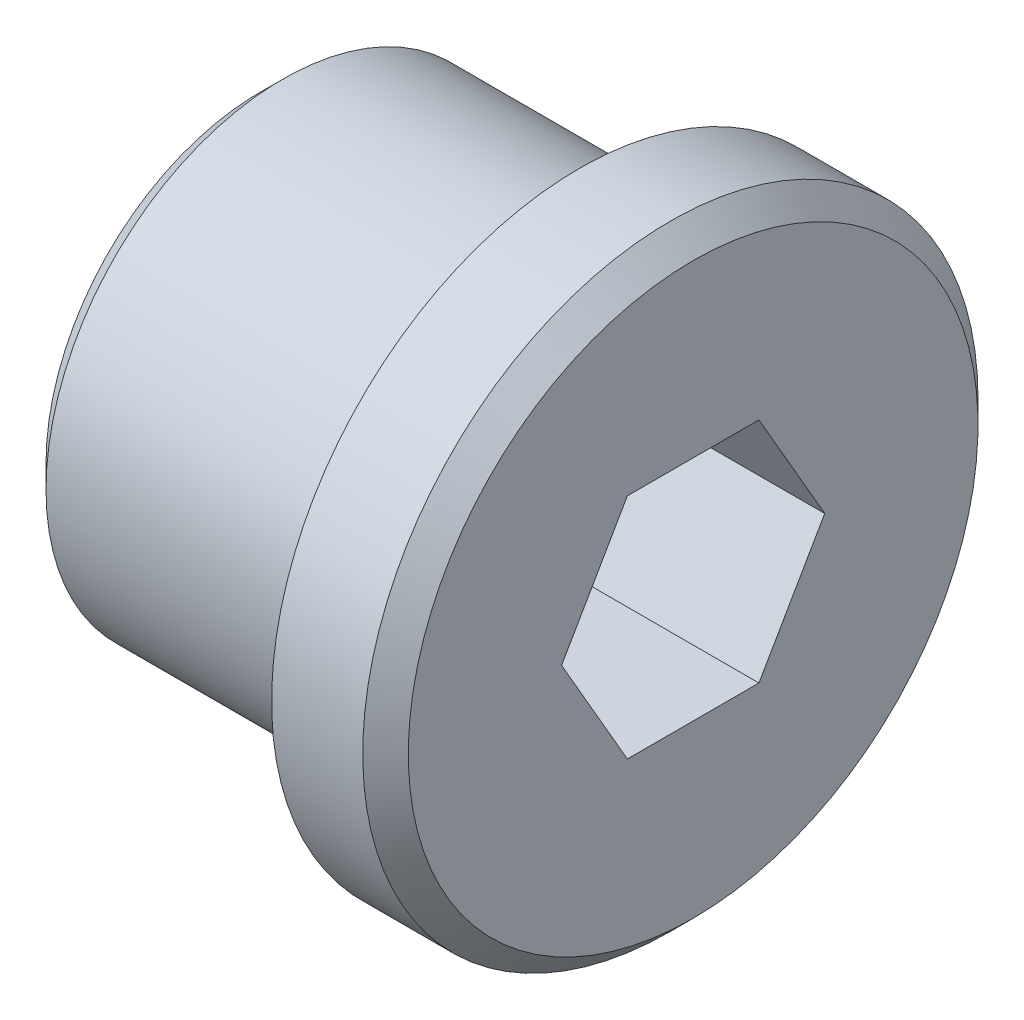
ISO-10303-21;
HEADER;
FILE_DESCRIPTION(('STEP AP214'),'2;1');
FILE_NAME('part.step','',(''),(''),'','','');
FILE_SCHEMA(('AUTOMOTIVE_DESIGN { 1 0 10303 214 1 1 1 1 }'));
ENDSEC;
DATA;
#1=APPLICATION_CONTEXT('core data for automotive mechanical design processes');
#2=APPLICATION_PROTOCOL_DEFINITION('international standard','automotive_design',2000,#1);
#3=PRODUCT_CONTEXT('',#1,'mechanical');
#4=PRODUCT('Part','Part','',(#3));
#5=PRODUCT_RELATED_PRODUCT_CATEGORY('part','',(#4));
#6=PRODUCT_DEFINITION_FORMATION('','',#4);
#7=PRODUCT_DEFINITION_CONTEXT('part definition',#1,'design');
#8=PRODUCT_DEFINITION('design','',#6,#7);
#9=PRODUCT_DEFINITION_SHAPE('','',#8);
#10=(LENGTH_UNIT() NAMED_UNIT(*) SI_UNIT(.MILLI.,.METRE.));
#11=(NAMED_UNIT(*) PLANE_ANGLE_UNIT() SI_UNIT($,.RADIAN.));
#12=(NAMED_UNIT(*) SI_UNIT($,.STERADIAN.) SOLID_ANGLE_UNIT());
#13=UNCERTAINTY_MEASURE_WITH_UNIT(LENGTH_MEASURE(1.E-05),#10,'distance_accuracy_value','');
#14=(GEOMETRIC_REPRESENTATION_CONTEXT(3) GLOBAL_UNCERTAINTY_ASSIGNED_CONTEXT((#13)) GLOBAL_UNIT_ASSIGNED_CONTEXT((#10,
#11,#12)) REPRESENTATION_CONTEXT('',''));
#15=CARTESIAN_POINT('',(0.,0.,0.));
#16=DIRECTION('',(0.,0.,1.));
#17=DIRECTION('',(1.,0.,0.));
#18=AXIS2_PLACEMENT_3D('',#15,#16,#17);
#19=CARTESIAN_POINT('',(186.5,-5.,222.660254037845));
#20=DIRECTION('',(1.,0.,0.));
#21=DIRECTION('',(0.,0.,-1.));
#22=AXIS2_PLACEMENT_3D('',#19,#20,#21);
#23=PLANE('',#22);
#24=DIRECTION('',(0.,0.,-1.));
#25=VECTOR('',#24,1.);
#26=CARTESIAN_POINT('',(186.5,-5.,216.886751345948));
#27=LINE('',#26,#25);
#28=CARTESIAN_POINT('',(186.5,-5.00000000000019,216.886751345948));
#29=VERTEX_POINT('',#28);
#30=CARTESIAN_POINT('',(186.5,-5.,211.113248654052));
#31=VERTEX_POINT('',#30);
#32=EDGE_CURVE('E68',#29,#31,#27,.T.);
#33=ORIENTED_EDGE('',*,*,#32,.T.);
#34=DIRECTION('',(0.,0.866025403784439,-0.5));
#35=VECTOR('',#34,1.);
#36=CARTESIAN_POINT('',(186.5,-5.,211.113248654052));
#37=LINE('',#36,#35);
#38=CARTESIAN_POINT('',(186.5,0.,208.226497308104));
#39=VERTEX_POINT('',#38);
#40=EDGE_CURVE('E91',#31,#39,#37,.T.);
#41=ORIENTED_EDGE('',*,*,#40,.T.);
#42=DIRECTION('',(0.,0.866025403784439,0.5));
#43=VECTOR('',#42,1.);
#44=CARTESIAN_POINT('',(186.5,0.,208.226497308104));
#45=LINE('',#44,#43);
#46=CARTESIAN_POINT('',(186.5,4.99999999999998,211.113248654052));
#47=VERTEX_POINT('',#46);
#48=EDGE_CURVE('E134',#39,#47,#45,.T.);
#49=ORIENTED_EDGE('',*,*,#48,.T.);
#50=DIRECTION('',(0.,0.,1.));
#51=VECTOR('',#50,1.);
#52=CARTESIAN_POINT('',(186.5,5.,211.113248654052));
#53=LINE('',#52,#51);
#54=CARTESIAN_POINT('',(186.5,5.,216.886751345948));
#55=VERTEX_POINT('',#54);
#56=EDGE_CURVE('E129',#47,#55,#53,.T.);
#57=ORIENTED_EDGE('',*,*,#56,.T.);
#58=DIRECTION('',(0.,-0.866025403784439,0.5));
#59=VECTOR('',#58,1.);
#60=CARTESIAN_POINT('',(186.5,5.,216.886751345948));
#61=LINE('',#60,#59);
#62=CARTESIAN_POINT('',(186.5,-1.69613679076899E-13,219.773502691897));
#63=VERTEX_POINT('',#62);
#64=EDGE_CURVE('E74',#55,#63,#61,.T.);
#65=ORIENTED_EDGE('',*,*,#64,.T.);
#66=DIRECTION('',(0.,-0.866025403784439,-0.5));
#67=VECTOR('',#66,1.);
#68=CARTESIAN_POINT('',(186.5,0.,219.773502691897));
#69=LINE('',#68,#67);
#70=EDGE_CURVE('E71',#63,#29,#69,.T.);
#71=ORIENTED_EDGE('',*,*,#70,.T.);
#72=EDGE_LOOP('',(#33,#41,#49,#57,#65,#71));
#73=FACE_BOUND('',#72,.T.);
#74=ADVANCED_FACE('F17',(#73),#23,.T.);
#75=CARTESIAN_POINT('',(186.5,0.,219.773502691897));
#76=DIRECTION('',(0.,-0.5,0.866025403784439));
#77=DIRECTION('',(0.,-0.866025403784439,-0.5));
#78=AXIS2_PLACEMENT_3D('',#75,#76,#77);
#79=PLANE('',#78);
#80=ORIENTED_EDGE('',*,*,#70,.F.);
#81=DIRECTION('',(1.,0.,0.));
#82=VECTOR('',#81,1.);
#83=CARTESIAN_POINT('',(186.5,-4.37150315946155E-13,219.773502691896));
#84=LINE('',#83,#82);
#85=CARTESIAN_POINT('',(194.,-1.621143570697E-13,219.773502691897));
#86=VERTEX_POINT('',#85);
#87=EDGE_CURVE('E124',#63,#86,#84,.T.);
#88=ORIENTED_EDGE('',*,*,#87,.T.);
#89=DIRECTION('',(0.,-0.866025403784371,-0.500000000000118));
#90=VECTOR('',#89,1.);
#91=CARTESIAN_POINT('',(194.,0.,219.773502691897));
#92=LINE('',#91,#90);
#93=CARTESIAN_POINT('',(194.,-5.00000000000019,216.886751345948));
#94=VERTEX_POINT('',#93);
#95=EDGE_CURVE('E82',#86,#94,#92,.T.);
#96=ORIENTED_EDGE('',*,*,#95,.T.);
#97=DIRECTION('',(1.,0.,0.));
#98=VECTOR('',#97,1.);
#99=CARTESIAN_POINT('',(186.5,-5.,216.886751345948));
#100=LINE('',#99,#98);
#101=EDGE_CURVE('E77',#94,#29,#100,.F.);
#102=ORIENTED_EDGE('',*,*,#101,.T.);
#103=EDGE_LOOP('',(#80,#88,#96,#102));
#104=FACE_BOUND('',#103,.T.);
#105=ADVANCED_FACE('F80',(#104),#79,.F.);
#106=CARTESIAN_POINT('',(186.5,-5.,216.886751345948));
#107=DIRECTION('',(0.,-1.,0.));
#108=DIRECTION('',(0.,0.,-1.));
#109=AXIS2_PLACEMENT_3D('',#106,#107,#108);
#110=PLANE('',#109);
#111=ORIENTED_EDGE('',*,*,#32,.F.);
#112=ORIENTED_EDGE('',*,*,#101,.F.);
#113=DIRECTION('',(0.,0.,1.));
#114=VECTOR('',#113,1.);
#115=CARTESIAN_POINT('',(194.,-5.,214.));
#116=LINE('',#115,#114);
#117=CARTESIAN_POINT('',(194.,-5.,211.113248654052));
#118=VERTEX_POINT('',#117);
#119=EDGE_CURVE('E121',#94,#118,#116,.F.);
#120=ORIENTED_EDGE('',*,*,#119,.T.);
#121=DIRECTION('',(1.,0.,0.));
#122=VECTOR('',#121,1.);
#123=CARTESIAN_POINT('',(186.5,-5.,211.113248654052));
#124=LINE('',#123,#122);
#125=EDGE_CURVE('E88',#118,#31,#124,.F.);
#126=ORIENTED_EDGE('',*,*,#125,.T.);
#127=EDGE_LOOP('',(#111,#112,#120,#126));
#128=FACE_BOUND('',#127,.T.);
#129=ADVANCED_FACE('F86',(#128),#110,.F.);
#130=CARTESIAN_POINT('',(186.5,-5.,211.113248654052));
#131=DIRECTION('',(0.,-0.5,-0.866025403784439));
#132=DIRECTION('',(0.,0.866025403784439,-0.5));
#133=AXIS2_PLACEMENT_3D('',#130,#131,#132);
#134=PLANE('',#133);
#135=ORIENTED_EDGE('',*,*,#40,.F.);
#136=ORIENTED_EDGE('',*,*,#125,.F.);
#137=DIRECTION('',(0.,0.866025403784446,-0.499999999999987));
#138=VECTOR('',#137,1.);
#139=CARTESIAN_POINT('',(194.,-5.,211.113248654052));
#140=LINE('',#139,#138);
#141=CARTESIAN_POINT('',(194.,0.,208.226497308104));
#142=VERTEX_POINT('',#141);
#143=EDGE_CURVE('E119',#118,#142,#140,.T.);
#144=ORIENTED_EDGE('',*,*,#143,.T.);
#145=DIRECTION('',(1.,0.,0.));
#146=VECTOR('',#145,1.);
#147=CARTESIAN_POINT('',(186.5,0.,208.226497308104));
#148=LINE('',#147,#146);
#149=EDGE_CURVE('E136',#142,#39,#148,.F.);
#150=ORIENTED_EDGE('',*,*,#149,.T.);
#151=EDGE_LOOP('',(#135,#136,#144,#150));
#152=FACE_BOUND('',#151,.T.);
#153=ADVANCED_FACE('F141',(#152),#134,.F.);
#154=CARTESIAN_POINT('',(186.5,0.,208.226497308104));
#155=DIRECTION('',(0.,0.5,-0.866025403784439));
#156=DIRECTION('',(0.,0.866025403784439,0.5));
#157=AXIS2_PLACEMENT_3D('',#154,#155,#156);
#158=PLANE('',#157);
#159=ORIENTED_EDGE('',*,*,#48,.F.);
#160=ORIENTED_EDGE('',*,*,#149,.F.);
#161=DIRECTION('',(0.,0.866025403784448,0.499999999999983));
#162=VECTOR('',#161,1.);
#163=CARTESIAN_POINT('',(194.,0.,208.226497308104));
#164=LINE('',#163,#162);
#165=CARTESIAN_POINT('',(194.,4.99999999999998,211.113248654052));
#166=VERTEX_POINT('',#165);
#167=EDGE_CURVE('E117',#142,#166,#164,.T.);
#168=ORIENTED_EDGE('',*,*,#167,.T.);
#169=DIRECTION('',(1.,0.,0.));
#170=VECTOR('',#169,1.);
#171=CARTESIAN_POINT('',(186.5,5.,211.113248654052));
#172=LINE('',#171,#170);
#173=EDGE_CURVE('E131',#166,#47,#172,.F.);
#174=ORIENTED_EDGE('',*,*,#173,.T.);
#175=EDGE_LOOP('',(#159,#160,#168,#174));
#176=FACE_BOUND('',#175,.T.);
#177=ADVANCED_FACE('F145',(#176),#158,.F.);
#178=CARTESIAN_POINT('',(186.5,5.,211.113248654052));
#179=DIRECTION('',(0.,1.,0.));
#180=DIRECTION('',(0.,0.,1.));
#181=AXIS2_PLACEMENT_3D('',#178,#179,#180);
#182=PLANE('',#181);
#183=ORIENTED_EDGE('',*,*,#56,.F.);
#184=ORIENTED_EDGE('',*,*,#173,.F.);
#185=DIRECTION('',(0.,0.,1.));
#186=VECTOR('',#185,1.);
#187=CARTESIAN_POINT('',(194.,5.,214.));
#188=LINE('',#187,#186);
#189=CARTESIAN_POINT('',(194.,5.,216.886751345948));
#190=VERTEX_POINT('',#189);
#191=EDGE_CURVE('E35',#166,#190,#188,.T.);
#192=ORIENTED_EDGE('',*,*,#191,.T.);
#193=DIRECTION('',(1.,0.,0.));
#194=VECTOR('',#193,1.);
#195=CARTESIAN_POINT('',(186.5,5.,216.886751345948));
#196=LINE('',#195,#194);
#197=EDGE_CURVE('E127',#190,#55,#196,.F.);
#198=ORIENTED_EDGE('',*,*,#197,.T.);
#199=EDGE_LOOP('',(#183,#184,#192,#198));
#200=FACE_BOUND('',#199,.T.);
#201=ADVANCED_FACE('F147',(#200),#182,.F.);
#202=CARTESIAN_POINT('',(186.5,5.,216.886751345948));
#203=DIRECTION('',(0.,0.5,0.866025403784439));
#204=DIRECTION('',(0.,-0.866025403784439,0.5));
#205=AXIS2_PLACEMENT_3D('',#202,#203,#204);
#206=PLANE('',#205);
#207=ORIENTED_EDGE('',*,*,#64,.F.);
#208=ORIENTED_EDGE('',*,*,#197,.F.);
#209=DIRECTION('',(0.,-0.866025403784378,0.500000000000104));
#210=VECTOR('',#209,1.);
#211=CARTESIAN_POINT('',(194.,5.,216.886751345948));
#212=LINE('',#211,#210);
#213=EDGE_CURVE('E107',#190,#86,#212,.T.);
#214=ORIENTED_EDGE('',*,*,#213,.T.);
#215=ORIENTED_EDGE('',*,*,#87,.F.);
#216=EDGE_LOOP('',(#207,#208,#214,#215));
#217=FACE_BOUND('',#216,.T.);
#218=ADVANCED_FACE('F150',(#217),#206,.F.);
#219=CARTESIAN_POINT('',(194.,0.,214.));
#220=DIRECTION('',(-1.,0.,0.));
#221=DIRECTION('',(0.,0.,1.));
#222=AXIS2_PLACEMENT_3D('',#219,#220,#221);
#223=PLANE('',#222);
#224=CARTESIAN_POINT('',(194.000000000897,0.,214.));
#225=DIRECTION('',(-1.,0.,0.));
#226=DIRECTION('',(0.,-1.,0.));
#227=AXIS2_PLACEMENT_3D('',#224,#225,#226);
#228=CIRCLE('',#227,12.5000000008974);
#229=CARTESIAN_POINT('',(194.000000000897,-12.5000000008974,214.));
#230=VERTEX_POINT('',#229);
#231=EDGE_CURVE('E20',#230,#230,#228,.T.);
#232=ORIENTED_EDGE('',*,*,#231,.F.);
#233=EDGE_LOOP('',(#232));
#234=FACE_BOUND('',#233,.T.);
#235=ORIENTED_EDGE('',*,*,#191,.F.);
#236=ORIENTED_EDGE('',*,*,#167,.F.);
#237=ORIENTED_EDGE('',*,*,#143,.F.);
#238=ORIENTED_EDGE('',*,*,#119,.F.);
#239=ORIENTED_EDGE('',*,*,#95,.F.);
#240=ORIENTED_EDGE('',*,*,#213,.F.);
#241=EDGE_LOOP('',(#235,#236,#237,#238,#239,#240));
#242=FACE_BOUND('',#241,.T.);
#243=ADVANCED_FACE('F152',(#234,#242),#223,.F.);
#244=CARTESIAN_POINT('',(193.,0.,214.));
#245=DIRECTION('',(-1.,0.,0.));
#246=DIRECTION('',(0.,-1.,0.));
#247=AXIS2_PLACEMENT_3D('',#244,#245,#246);
#248=CONICAL_SURFACE('',#247,13.5,0.7853981625);
#249=ORIENTED_EDGE('',*,*,#231,.T.);
#250=EDGE_LOOP('',(#249));
#251=FACE_BOUND('',#250,.T.);
#252=CARTESIAN_POINT('',(193.,0.,214.));
#253=DIRECTION('',(1.,0.,0.));
#254=DIRECTION('',(0.,0.,-1.));
#255=AXIS2_PLACEMENT_3D('',#252,#253,#254);
#256=CIRCLE('',#255,13.5);
#257=CARTESIAN_POINT('',(193.,0.,200.5));
#258=VERTEX_POINT('',#257);
#259=EDGE_CURVE('E99',#258,#258,#256,.F.);
#260=ORIENTED_EDGE('',*,*,#259,.F.);
#261=EDGE_LOOP('',(#260));
#262=FACE_BOUND('',#261,.T.);
#263=ADVANCED_FACE('F154',(#251,#262),#248,.T.);
#264=CARTESIAN_POINT('',(175.,0.,214.));
#265=DIRECTION('',(-1.,0.,0.));
#266=DIRECTION('',(0.,0.,1.));
#267=AXIS2_PLACEMENT_3D('',#264,#265,#266);
#268=PLANE('',#267);
#269=CARTESIAN_POINT('',(174.999999999103,0.,214.));
#270=DIRECTION('',(1.,0.,0.));
#271=DIRECTION('',(0.,0.,-1.));
#272=AXIS2_PLACEMENT_3D('',#269,#270,#271);
#273=CIRCLE('',#272,9.40000000089747);
#274=CARTESIAN_POINT('',(174.999999999103,0.,204.599999999103));
#275=VERTEX_POINT('',#274);
#276=EDGE_CURVE('E97',#275,#275,#273,.T.);
#277=ORIENTED_EDGE('',*,*,#276,.F.);
#278=EDGE_LOOP('',(#277));
#279=FACE_BOUND('',#278,.T.);
#280=ADVANCED_FACE('F162',(#279),#268,.T.);
#281=CARTESIAN_POINT('',(175.,0.,214.));
#282=DIRECTION('',(1.,0.,0.));
#283=DIRECTION('',(0.,0.,-1.));
#284=AXIS2_PLACEMENT_3D('',#281,#282,#283);
#285=CYLINDRICAL_SURFACE('',#284,13.5);
#286=CARTESIAN_POINT('',(189.,0.,214.));
#287=DIRECTION('',(1.,0.,0.));
#288=DIRECTION('',(0.,0.,-1.));
#289=AXIS2_PLACEMENT_3D('',#286,#287,#288);
#290=CIRCLE('',#289,13.5);
#291=CARTESIAN_POINT('',(189.,0.,200.5));
#292=VERTEX_POINT('',#291);
#293=EDGE_CURVE('E95',#292,#292,#290,.F.);
#294=ORIENTED_EDGE('',*,*,#293,.F.);
#295=EDGE_LOOP('',(#294));
#296=FACE_BOUND('',#295,.T.);
#297=ORIENTED_EDGE('',*,*,#259,.T.);
#298=EDGE_LOOP('',(#297));
#299=FACE_BOUND('',#298,.T.);
#300=ADVANCED_FACE('F182',(#296,#299),#285,.T.);
#301=CARTESIAN_POINT('',(176.,0.,214.));
#302=DIRECTION('',(1.,0.,0.));
#303=DIRECTION('',(0.,0.,-1.));
#304=AXIS2_PLACEMENT_3D('',#301,#302,#303);
#305=CONICAL_SURFACE('',#304,10.4,0.785398162499986);
#306=ORIENTED_EDGE('',*,*,#276,.T.);
#307=EDGE_LOOP('',(#306));
#308=FACE_BOUND('',#307,.T.);
#309=CARTESIAN_POINT('',(176.,0.,214.));
#310=DIRECTION('',(-1.,0.,0.));
#311=DIRECTION('',(0.,0.,1.));
#312=AXIS2_PLACEMENT_3D('',#309,#310,#311);
#313=CIRCLE('',#312,10.4);
#314=CARTESIAN_POINT('',(176.,0.,224.4));
#315=VERTEX_POINT('',#314);
#316=EDGE_CURVE('E26',#315,#315,#313,.F.);
#317=ORIENTED_EDGE('',*,*,#316,.F.);
#318=EDGE_LOOP('',(#317));
#319=FACE_BOUND('',#318,.T.);
#320=ADVANCED_FACE('F175',(#308,#319),#305,.T.);
#321=CARTESIAN_POINT('',(189.,0.,214.));
#322=DIRECTION('',(-1.,0.,0.));
#323=DIRECTION('',(0.,0.,1.));
#324=AXIS2_PLACEMENT_3D('',#321,#322,#323);
#325=PLANE('',#324);
#326=CARTESIAN_POINT('',(189.,0.,214.));
#327=DIRECTION('',(-1.,0.,0.));
#328=DIRECTION('',(0.,0.,1.));
#329=AXIS2_PLACEMENT_3D('',#326,#327,#328);
#330=CIRCLE('',#329,10.4);
#331=CARTESIAN_POINT('',(189.,0.,224.4));
#332=VERTEX_POINT('',#331);
#333=EDGE_CURVE('E11',#332,#332,#330,.T.);
#334=ORIENTED_EDGE('',*,*,#333,.F.);
#335=EDGE_LOOP('',(#334));
#336=FACE_BOUND('',#335,.T.);
#337=ORIENTED_EDGE('',*,*,#293,.T.);
#338=EDGE_LOOP('',(#337));
#339=FACE_BOUND('',#338,.T.);
#340=ADVANCED_FACE('F169',(#336,#339),#325,.T.);
#341=CARTESIAN_POINT('',(189.,0.,214.));
#342=DIRECTION('',(-1.,0.,0.));
#343=DIRECTION('',(0.,0.,1.));
#344=AXIS2_PLACEMENT_3D('',#341,#342,#343);
#345=CYLINDRICAL_SURFACE('',#344,10.4);
#346=ORIENTED_EDGE('',*,*,#333,.T.);
#347=EDGE_LOOP('',(#346));
#348=FACE_BOUND('',#347,.T.);
#349=ORIENTED_EDGE('',*,*,#316,.T.);
#350=EDGE_LOOP('',(#349));
#351=FACE_BOUND('',#350,.T.);
#352=ADVANCED_FACE('F167',(#348,#351),#345,.T.);
#353=CLOSED_SHELL('',(#74,#105,#129,#153,#177,#201,#218,#243,#263,#280,#300,#320,#340,#352));
#354=MANIFOLD_SOLID_BREP('B1',#353);
#355=ADVANCED_BREP_SHAPE_REPRESENTATION('',(#18,#354),#14);
#356=SHAPE_DEFINITION_REPRESENTATION(#9,#355);
ENDSEC;
END-ISO-10303-21;
